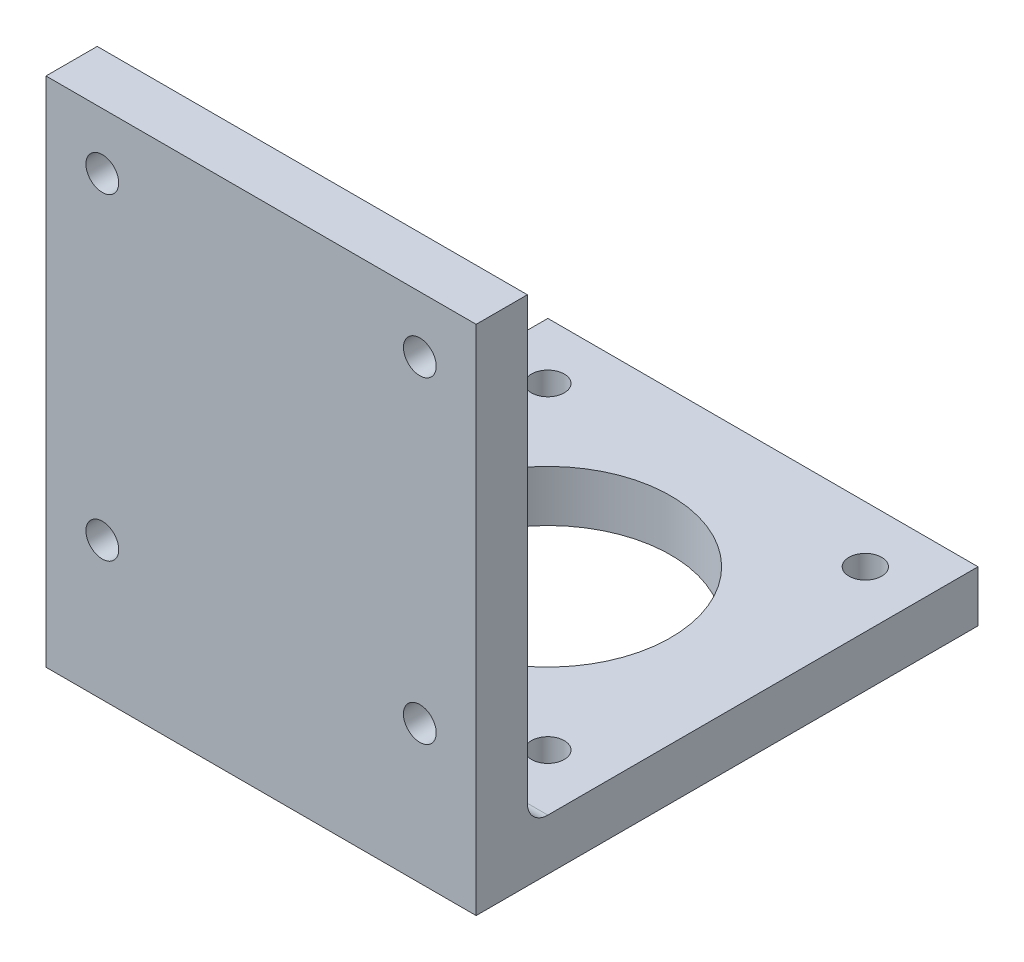
ISO-10303-21;
HEADER;
FILE_DESCRIPTION(('STEP AP214'),'2;1');
FILE_NAME('part.step','',(''),(''),'','','');
FILE_SCHEMA(('AUTOMOTIVE_DESIGN { 1 0 10303 214 1 1 1 1 }'));
ENDSEC;
DATA;
#1=APPLICATION_CONTEXT('core data for automotive mechanical design processes');
#2=APPLICATION_PROTOCOL_DEFINITION('international standard','automotive_design',2000,#1);
#3=PRODUCT_CONTEXT('',#1,'mechanical');
#4=PRODUCT('Part','Part','',(#3));
#5=PRODUCT_RELATED_PRODUCT_CATEGORY('part','',(#4));
#6=PRODUCT_DEFINITION_FORMATION('','',#4);
#7=PRODUCT_DEFINITION_CONTEXT('part definition',#1,'design');
#8=PRODUCT_DEFINITION('design','',#6,#7);
#9=PRODUCT_DEFINITION_SHAPE('','',#8);
#10=(LENGTH_UNIT() NAMED_UNIT(*) SI_UNIT(.MILLI.,.METRE.));
#11=(NAMED_UNIT(*) PLANE_ANGLE_UNIT() SI_UNIT($,.RADIAN.));
#12=(NAMED_UNIT(*) SI_UNIT($,.STERADIAN.) SOLID_ANGLE_UNIT());
#13=UNCERTAINTY_MEASURE_WITH_UNIT(LENGTH_MEASURE(1.E-05),#10,'distance_accuracy_value','');
#14=(GEOMETRIC_REPRESENTATION_CONTEXT(3) GLOBAL_UNCERTAINTY_ASSIGNED_CONTEXT((#13)) GLOBAL_UNIT_ASSIGNED_CONTEXT((#10,
#11,#12)) REPRESENTATION_CONTEXT('',''));
#15=CARTESIAN_POINT('',(0.,0.,0.));
#16=DIRECTION('',(0.,0.,1.));
#17=DIRECTION('',(1.,0.,0.));
#18=AXIS2_PLACEMENT_3D('',#15,#16,#17);
#19=CARTESIAN_POINT('',(0.,5.,0.));
#20=DIRECTION('',(0.,-1.,0.));
#21=DIRECTION('',(0.,0.,-1.));
#22=AXIS2_PLACEMENT_3D('',#19,#20,#21);
#23=PLANE('',#22);
#24=DIRECTION('',(0.,0.,1.));
#25=VECTOR('',#24,1.);
#26=CARTESIAN_POINT('',(-21.,5.,21.));
#27=LINE('',#26,#25);
#28=CARTESIAN_POINT('',(-21.,5.,-21.));
#29=VERTEX_POINT('',#28);
#30=CARTESIAN_POINT('',(-21.,5.,21.));
#31=VERTEX_POINT('',#30);
#32=EDGE_CURVE('E171',#29,#31,#27,.T.);
#33=ORIENTED_EDGE('',*,*,#32,.T.);
#34=DIRECTION('',(1.,0.,0.));
#35=VECTOR('',#34,1.);
#36=CARTESIAN_POINT('',(0.,5.,21.));
#37=LINE('',#36,#35);
#38=CARTESIAN_POINT('',(21.,5.,21.));
#39=VERTEX_POINT('',#38);
#40=EDGE_CURVE('E180',#31,#39,#37,.T.);
#41=ORIENTED_EDGE('',*,*,#40,.T.);
#42=DIRECTION('',(0.,0.,-1.));
#43=VECTOR('',#42,1.);
#44=CARTESIAN_POINT('',(21.,5.,21.));
#45=LINE('',#44,#43);
#46=CARTESIAN_POINT('',(21.,5.,-21.));
#47=VERTEX_POINT('',#46);
#48=EDGE_CURVE('E167',#39,#47,#45,.T.);
#49=ORIENTED_EDGE('',*,*,#48,.T.);
#50=DIRECTION('',(-1.,0.,0.));
#51=VECTOR('',#50,1.);
#52=CARTESIAN_POINT('',(-21.,5.,-21.));
#53=LINE('',#52,#51);
#54=EDGE_CURVE('E169',#47,#29,#53,.T.);
#55=ORIENTED_EDGE('',*,*,#54,.T.);
#56=EDGE_LOOP('',(#33,#41,#49,#55));
#57=FACE_BOUND('',#56,.T.);
#58=CARTESIAN_POINT('',(-15.5,5.,-15.5));
#59=DIRECTION('',(0.,1.,0.));
#60=DIRECTION('',(0.,0.,1.));
#61=AXIS2_PLACEMENT_3D('',#58,#59,#60);
#62=CIRCLE('',#61,1.6);
#63=CARTESIAN_POINT('',(-15.5,5.,-13.9));
#64=VERTEX_POINT('',#63);
#65=EDGE_CURVE('E162',#64,#64,#62,.T.);
#66=ORIENTED_EDGE('',*,*,#65,.F.);
#67=EDGE_LOOP('',(#66));
#68=FACE_BOUND('',#67,.T.);
#69=CARTESIAN_POINT('',(0.,5.,0.));
#70=DIRECTION('',(0.,1.,0.));
#71=DIRECTION('',(0.,0.,1.));
#72=AXIS2_PLACEMENT_3D('',#69,#70,#71);
#73=CIRCLE('',#72,12.);
#74=CARTESIAN_POINT('',(0.,5.,12.));
#75=VERTEX_POINT('',#74);
#76=EDGE_CURVE('E156',#75,#75,#73,.T.);
#77=ORIENTED_EDGE('',*,*,#76,.F.);
#78=EDGE_LOOP('',(#77));
#79=FACE_BOUND('',#78,.T.);
#80=CARTESIAN_POINT('',(15.5,5.,-15.5));
#81=DIRECTION('',(0.,1.,0.));
#82=DIRECTION('',(0.,0.,1.));
#83=AXIS2_PLACEMENT_3D('',#80,#81,#82);
#84=CIRCLE('',#83,1.6);
#85=CARTESIAN_POINT('',(15.5,5.,-13.9));
#86=VERTEX_POINT('',#85);
#87=EDGE_CURVE('E150',#86,#86,#84,.T.);
#88=ORIENTED_EDGE('',*,*,#87,.F.);
#89=EDGE_LOOP('',(#88));
#90=FACE_BOUND('',#89,.T.);
#91=CARTESIAN_POINT('',(-15.5,5.,15.5));
#92=DIRECTION('',(0.,1.,0.));
#93=DIRECTION('',(0.,0.,1.));
#94=AXIS2_PLACEMENT_3D('',#91,#92,#93);
#95=CIRCLE('',#94,1.6);
#96=CARTESIAN_POINT('',(-15.5,5.,17.1));
#97=VERTEX_POINT('',#96);
#98=EDGE_CURVE('E144',#97,#97,#95,.T.);
#99=ORIENTED_EDGE('',*,*,#98,.F.);
#100=EDGE_LOOP('',(#99));
#101=FACE_BOUND('',#100,.T.);
#102=CARTESIAN_POINT('',(15.5,5.,15.5));
#103=DIRECTION('',(0.,1.,0.));
#104=DIRECTION('',(0.,0.,1.));
#105=AXIS2_PLACEMENT_3D('',#102,#103,#104);
#106=CIRCLE('',#105,1.6);
#107=CARTESIAN_POINT('',(15.5,5.,17.1));
#108=VERTEX_POINT('',#107);
#109=EDGE_CURVE('E138',#108,#108,#106,.T.);
#110=ORIENTED_EDGE('',*,*,#109,.F.);
#111=EDGE_LOOP('',(#110));
#112=FACE_BOUND('',#111,.T.);
#113=ADVANCED_FACE('F32',(#57,#68,#79,#90,#101,#112),#23,.F.);
#114=CARTESIAN_POINT('',(0.,0.,0.));
#115=DIRECTION('',(0.,-1.,0.));
#116=DIRECTION('',(0.,0.,-1.));
#117=AXIS2_PLACEMENT_3D('',#114,#115,#116);
#118=PLANE('',#117);
#119=CARTESIAN_POINT('',(-15.5,0.,15.5));
#120=DIRECTION('',(0.,1.,0.));
#121=DIRECTION('',(0.,0.,1.));
#122=AXIS2_PLACEMENT_3D('',#119,#120,#121);
#123=CIRCLE('',#122,1.6);
#124=CARTESIAN_POINT('',(-15.5,0.,17.1));
#125=VERTEX_POINT('',#124);
#126=EDGE_CURVE('E141',#125,#125,#123,.T.);
#127=ORIENTED_EDGE('',*,*,#126,.T.);
#128=EDGE_LOOP('',(#127));
#129=FACE_BOUND('',#128,.T.);
#130=CARTESIAN_POINT('',(0.,0.,0.));
#131=DIRECTION('',(0.,1.,0.));
#132=DIRECTION('',(0.,0.,1.));
#133=AXIS2_PLACEMENT_3D('',#130,#131,#132);
#134=CIRCLE('',#133,12.);
#135=CARTESIAN_POINT('',(0.,0.,12.));
#136=VERTEX_POINT('',#135);
#137=EDGE_CURVE('E153',#136,#136,#134,.T.);
#138=ORIENTED_EDGE('',*,*,#137,.T.);
#139=EDGE_LOOP('',(#138));
#140=FACE_BOUND('',#139,.T.);
#141=DIRECTION('',(-1.,0.,0.));
#142=VECTOR('',#141,1.);
#143=CARTESIAN_POINT('',(-21.,0.,-21.));
#144=LINE('',#143,#142);
#145=CARTESIAN_POINT('',(21.,0.,-21.));
#146=VERTEX_POINT('',#145);
#147=CARTESIAN_POINT('',(-21.,0.,-21.));
#148=VERTEX_POINT('',#147);
#149=EDGE_CURVE('E103',#146,#148,#144,.T.);
#150=ORIENTED_EDGE('',*,*,#149,.F.);
#151=DIRECTION('',(0.,0.,-1.));
#152=VECTOR('',#151,1.);
#153=CARTESIAN_POINT('',(21.,0.,21.));
#154=LINE('',#153,#152);
#155=CARTESIAN_POINT('',(21.,0.,28.));
#156=VERTEX_POINT('',#155);
#157=EDGE_CURVE('E102',#156,#146,#154,.T.);
#158=ORIENTED_EDGE('',*,*,#157,.F.);
#159=DIRECTION('',(1.,0.,0.));
#160=VECTOR('',#159,1.);
#161=CARTESIAN_POINT('',(-21.,0.,28.));
#162=LINE('',#161,#160);
#163=CARTESIAN_POINT('',(-21.,0.,28.));
#164=VERTEX_POINT('',#163);
#165=EDGE_CURVE('E106',#164,#156,#162,.T.);
#166=ORIENTED_EDGE('',*,*,#165,.F.);
#167=DIRECTION('',(0.,0.,1.));
#168=VECTOR('',#167,1.);
#169=CARTESIAN_POINT('',(-21.,0.,21.));
#170=LINE('',#169,#168);
#171=EDGE_CURVE('E90',#148,#164,#170,.T.);
#172=ORIENTED_EDGE('',*,*,#171,.F.);
#173=EDGE_LOOP('',(#150,#158,#166,#172));
#174=FACE_BOUND('',#173,.T.);
#175=CARTESIAN_POINT('',(-15.5,0.,-15.5));
#176=DIRECTION('',(0.,1.,0.));
#177=DIRECTION('',(0.,0.,1.));
#178=AXIS2_PLACEMENT_3D('',#175,#176,#177);
#179=CIRCLE('',#178,1.6);
#180=CARTESIAN_POINT('',(-15.5,0.,-13.9));
#181=VERTEX_POINT('',#180);
#182=EDGE_CURVE('E159',#181,#181,#179,.T.);
#183=ORIENTED_EDGE('',*,*,#182,.T.);
#184=EDGE_LOOP('',(#183));
#185=FACE_BOUND('',#184,.T.);
#186=CARTESIAN_POINT('',(15.5,0.,-15.5));
#187=DIRECTION('',(0.,1.,0.));
#188=DIRECTION('',(0.,0.,1.));
#189=AXIS2_PLACEMENT_3D('',#186,#187,#188);
#190=CIRCLE('',#189,1.6);
#191=CARTESIAN_POINT('',(15.5,0.,-13.9));
#192=VERTEX_POINT('',#191);
#193=EDGE_CURVE('E147',#192,#192,#190,.T.);
#194=ORIENTED_EDGE('',*,*,#193,.T.);
#195=EDGE_LOOP('',(#194));
#196=FACE_BOUND('',#195,.T.);
#197=CARTESIAN_POINT('',(15.5,0.,15.5));
#198=DIRECTION('',(0.,1.,0.));
#199=DIRECTION('',(0.,0.,1.));
#200=AXIS2_PLACEMENT_3D('',#197,#198,#199);
#201=CIRCLE('',#200,1.6);
#202=CARTESIAN_POINT('',(15.5,0.,17.1));
#203=VERTEX_POINT('',#202);
#204=EDGE_CURVE('E137',#203,#203,#201,.T.);
#205=ORIENTED_EDGE('',*,*,#204,.T.);
#206=EDGE_LOOP('',(#205));
#207=FACE_BOUND('',#206,.T.);
#208=ADVANCED_FACE('F107',(#129,#140,#174,#185,#196,#207),#118,.T.);
#209=CARTESIAN_POINT('',(-21.,5.,-21.));
#210=DIRECTION('',(0.,0.,1.));
#211=DIRECTION('',(1.,0.,0.));
#212=AXIS2_PLACEMENT_3D('',#209,#210,#211);
#213=PLANE('',#212);
#214=ORIENTED_EDGE('',*,*,#149,.T.);
#215=DIRECTION('',(0.,-1.,0.));
#216=VECTOR('',#215,1.);
#217=CARTESIAN_POINT('',(-21.,5.,-21.));
#218=LINE('',#217,#216);
#219=EDGE_CURVE('E98',#29,#148,#218,.T.);
#220=ORIENTED_EDGE('',*,*,#219,.F.);
#221=ORIENTED_EDGE('',*,*,#54,.F.);
#222=DIRECTION('',(0.,-1.,0.));
#223=VECTOR('',#222,1.);
#224=CARTESIAN_POINT('',(21.,5.,-21.));
#225=LINE('',#224,#223);
#226=EDGE_CURVE('E177',#47,#146,#225,.T.);
#227=ORIENTED_EDGE('',*,*,#226,.T.);
#228=EDGE_LOOP('',(#214,#220,#221,#227));
#229=FACE_BOUND('',#228,.T.);
#230=ADVANCED_FACE('F192',(#229),#213,.F.);
#231=CARTESIAN_POINT('',(-21.,5.,21.));
#232=DIRECTION('',(1.,0.,0.));
#233=DIRECTION('',(0.,0.,-1.));
#234=AXIS2_PLACEMENT_3D('',#231,#232,#233);
#235=PLANE('',#234);
#236=ORIENTED_EDGE('',*,*,#171,.T.);
#237=DIRECTION('',(0.,-1.,0.));
#238=VECTOR('',#237,1.);
#239=CARTESIAN_POINT('',(-21.,0.,28.));
#240=LINE('',#239,#238);
#241=CARTESIAN_POINT('',(-21.,50.,28.));
#242=VERTEX_POINT('',#241);
#243=EDGE_CURVE('E95',#242,#164,#240,.T.);
#244=ORIENTED_EDGE('',*,*,#243,.F.);
#245=DIRECTION('',(0.,0.,-1.));
#246=VECTOR('',#245,1.);
#247=CARTESIAN_POINT('',(-21.,50.,28.));
#248=LINE('',#247,#246);
#249=CARTESIAN_POINT('',(-21.,50.,23.));
#250=VERTEX_POINT('',#249);
#251=EDGE_CURVE('E128',#242,#250,#248,.T.);
#252=ORIENTED_EDGE('',*,*,#251,.T.);
#253=DIRECTION('',(0.,-1.,0.));
#254=VECTOR('',#253,1.);
#255=CARTESIAN_POINT('',(-21.,0.,23.));
#256=LINE('',#255,#254);
#257=CARTESIAN_POINT('',(-21.,7.,23.));
#258=VERTEX_POINT('',#257);
#259=EDGE_CURVE('E129',#250,#258,#256,.T.);
#260=ORIENTED_EDGE('',*,*,#259,.T.);
#261=CARTESIAN_POINT('',(-21.,7.,21.));
#262=DIRECTION('',(1.,0.,0.));
#263=DIRECTION('',(0.,0.,-1.));
#264=AXIS2_PLACEMENT_3D('',#261,#262,#263);
#265=CIRCLE('',#264,2.);
#266=EDGE_CURVE('E11',#258,#31,#265,.T.);
#267=ORIENTED_EDGE('',*,*,#266,.T.);
#268=ORIENTED_EDGE('',*,*,#32,.F.);
#269=ORIENTED_EDGE('',*,*,#219,.T.);
#270=EDGE_LOOP('',(#236,#244,#252,#260,#267,#268,#269));
#271=FACE_BOUND('',#270,.T.);
#272=ADVANCED_FACE('F92',(#271),#235,.F.);
#273=CARTESIAN_POINT('',(21.,5.,21.));
#274=DIRECTION('',(-1.,0.,0.));
#275=DIRECTION('',(0.,0.,1.));
#276=AXIS2_PLACEMENT_3D('',#273,#274,#275);
#277=PLANE('',#276);
#278=ORIENTED_EDGE('',*,*,#157,.T.);
#279=ORIENTED_EDGE('',*,*,#226,.F.);
#280=ORIENTED_EDGE('',*,*,#48,.F.);
#281=CARTESIAN_POINT('',(21.,7.,21.));
#282=DIRECTION('',(-1.,0.,0.));
#283=DIRECTION('',(0.,0.,1.));
#284=AXIS2_PLACEMENT_3D('',#281,#282,#283);
#285=CIRCLE('',#284,2.);
#286=CARTESIAN_POINT('',(21.,7.,23.));
#287=VERTEX_POINT('',#286);
#288=EDGE_CURVE('E40',#39,#287,#285,.T.);
#289=ORIENTED_EDGE('',*,*,#288,.T.);
#290=DIRECTION('',(0.,1.,0.));
#291=VECTOR('',#290,1.);
#292=CARTESIAN_POINT('',(21.,0.,23.));
#293=LINE('',#292,#291);
#294=CARTESIAN_POINT('',(21.,50.,23.));
#295=VERTEX_POINT('',#294);
#296=EDGE_CURVE('E120',#287,#295,#293,.T.);
#297=ORIENTED_EDGE('',*,*,#296,.T.);
#298=DIRECTION('',(0.,0.,-1.));
#299=VECTOR('',#298,1.);
#300=CARTESIAN_POINT('',(21.,50.,28.));
#301=LINE('',#300,#299);
#302=CARTESIAN_POINT('',(21.,50.,28.));
#303=VERTEX_POINT('',#302);
#304=EDGE_CURVE('E134',#303,#295,#301,.T.);
#305=ORIENTED_EDGE('',*,*,#304,.F.);
#306=DIRECTION('',(0.,1.,0.));
#307=VECTOR('',#306,1.);
#308=CARTESIAN_POINT('',(21.,0.,28.));
#309=LINE('',#308,#307);
#310=EDGE_CURVE('E111',#156,#303,#309,.T.);
#311=ORIENTED_EDGE('',*,*,#310,.F.);
#312=EDGE_LOOP('',(#278,#279,#280,#289,#297,#305,#311));
#313=FACE_BOUND('',#312,.T.);
#314=ADVANCED_FACE('F190',(#313),#277,.F.);
#315=CARTESIAN_POINT('',(-15.5,5.,-15.5));
#316=DIRECTION('',(0.,-1.,0.));
#317=DIRECTION('',(0.,0.,-1.));
#318=AXIS2_PLACEMENT_3D('',#315,#316,#317);
#319=CYLINDRICAL_SURFACE('',#318,1.6);
#320=ORIENTED_EDGE('',*,*,#65,.T.);
#321=EDGE_LOOP('',(#320));
#322=FACE_BOUND('',#321,.T.);
#323=ORIENTED_EDGE('',*,*,#182,.F.);
#324=EDGE_LOOP('',(#323));
#325=FACE_BOUND('',#324,.T.);
#326=ADVANCED_FACE('F209',(#322,#325),#319,.F.);
#327=CARTESIAN_POINT('',(0.,5.,0.));
#328=DIRECTION('',(0.,-1.,0.));
#329=DIRECTION('',(0.,0.,-1.));
#330=AXIS2_PLACEMENT_3D('',#327,#328,#329);
#331=CYLINDRICAL_SURFACE('',#330,12.);
#332=ORIENTED_EDGE('',*,*,#76,.T.);
#333=EDGE_LOOP('',(#332));
#334=FACE_BOUND('',#333,.T.);
#335=ORIENTED_EDGE('',*,*,#137,.F.);
#336=EDGE_LOOP('',(#335));
#337=FACE_BOUND('',#336,.T.);
#338=ADVANCED_FACE('F235',(#334,#337),#331,.F.);
#339=CARTESIAN_POINT('',(15.5,5.,-15.5));
#340=DIRECTION('',(0.,-1.,0.));
#341=DIRECTION('',(0.,0.,-1.));
#342=AXIS2_PLACEMENT_3D('',#339,#340,#341);
#343=CYLINDRICAL_SURFACE('',#342,1.6);
#344=ORIENTED_EDGE('',*,*,#87,.T.);
#345=EDGE_LOOP('',(#344));
#346=FACE_BOUND('',#345,.T.);
#347=ORIENTED_EDGE('',*,*,#193,.F.);
#348=EDGE_LOOP('',(#347));
#349=FACE_BOUND('',#348,.T.);
#350=ADVANCED_FACE('F242',(#346,#349),#343,.F.);
#351=CARTESIAN_POINT('',(-15.5,5.,15.5));
#352=DIRECTION('',(0.,-1.,0.));
#353=DIRECTION('',(0.,0.,-1.));
#354=AXIS2_PLACEMENT_3D('',#351,#352,#353);
#355=CYLINDRICAL_SURFACE('',#354,1.6);
#356=ORIENTED_EDGE('',*,*,#98,.T.);
#357=EDGE_LOOP('',(#356));
#358=FACE_BOUND('',#357,.T.);
#359=ORIENTED_EDGE('',*,*,#126,.F.);
#360=EDGE_LOOP('',(#359));
#361=FACE_BOUND('',#360,.T.);
#362=ADVANCED_FACE('F249',(#358,#361),#355,.F.);
#363=CARTESIAN_POINT('',(15.5,5.,15.5));
#364=DIRECTION('',(0.,-1.,0.));
#365=DIRECTION('',(0.,0.,-1.));
#366=AXIS2_PLACEMENT_3D('',#363,#364,#365);
#367=CYLINDRICAL_SURFACE('',#366,1.6);
#368=ORIENTED_EDGE('',*,*,#109,.T.);
#369=EDGE_LOOP('',(#368));
#370=FACE_BOUND('',#369,.T.);
#371=ORIENTED_EDGE('',*,*,#204,.F.);
#372=EDGE_LOOP('',(#371));
#373=FACE_BOUND('',#372,.T.);
#374=ADVANCED_FACE('F257',(#370,#373),#367,.F.);
#375=CARTESIAN_POINT('',(0.,0.,23.));
#376=DIRECTION('',(0.,0.,-1.));
#377=DIRECTION('',(-1.,0.,0.));
#378=AXIS2_PLACEMENT_3D('',#375,#376,#377);
#379=PLANE('',#378);
#380=CARTESIAN_POINT('',(15.5,44.5,23.));
#381=DIRECTION('',(0.,0.,1.));
#382=DIRECTION('',(1.,0.,0.));
#383=AXIS2_PLACEMENT_3D('',#380,#381,#382);
#384=CIRCLE('',#383,1.6);
#385=CARTESIAN_POINT('',(17.1,44.5,23.));
#386=VERTEX_POINT('',#385);
#387=EDGE_CURVE('E386',#386,#386,#384,.T.);
#388=ORIENTED_EDGE('',*,*,#387,.T.);
#389=EDGE_LOOP('',(#388));
#390=FACE_BOUND('',#389,.T.);
#391=CARTESIAN_POINT('',(15.5,13.5,23.));
#392=DIRECTION('',(0.,0.,1.));
#393=DIRECTION('',(1.,0.,0.));
#394=AXIS2_PLACEMENT_3D('',#391,#392,#393);
#395=CIRCLE('',#394,1.6);
#396=CARTESIAN_POINT('',(17.1,13.5,23.));
#397=VERTEX_POINT('',#396);
#398=EDGE_CURVE('E383',#397,#397,#395,.T.);
#399=ORIENTED_EDGE('',*,*,#398,.T.);
#400=EDGE_LOOP('',(#399));
#401=FACE_BOUND('',#400,.T.);
#402=CARTESIAN_POINT('',(-15.5,44.5,23.));
#403=DIRECTION('',(0.,0.,1.));
#404=DIRECTION('',(1.,0.,0.));
#405=AXIS2_PLACEMENT_3D('',#402,#403,#404);
#406=CIRCLE('',#405,1.6);
#407=CARTESIAN_POINT('',(-13.9,44.5,23.));
#408=VERTEX_POINT('',#407);
#409=EDGE_CURVE('E123',#408,#408,#406,.T.);
#410=ORIENTED_EDGE('',*,*,#409,.T.);
#411=EDGE_LOOP('',(#410));
#412=FACE_BOUND('',#411,.T.);
#413=CARTESIAN_POINT('',(-15.5,13.5,23.));
#414=DIRECTION('',(0.,0.,1.));
#415=DIRECTION('',(1.,0.,0.));
#416=AXIS2_PLACEMENT_3D('',#413,#414,#415);
#417=CIRCLE('',#416,1.6);
#418=CARTESIAN_POINT('',(-13.9,13.5,23.));
#419=VERTEX_POINT('',#418);
#420=EDGE_CURVE('E379',#419,#419,#417,.T.);
#421=ORIENTED_EDGE('',*,*,#420,.T.);
#422=EDGE_LOOP('',(#421));
#423=FACE_BOUND('',#422,.T.);
#424=ORIENTED_EDGE('',*,*,#296,.F.);
#425=DIRECTION('',(1.,0.,0.));
#426=VECTOR('',#425,1.);
#427=CARTESIAN_POINT('',(0.,7.,23.));
#428=LINE('',#427,#426);
#429=EDGE_CURVE('E53',#287,#258,#428,.F.);
#430=ORIENTED_EDGE('',*,*,#429,.T.);
#431=ORIENTED_EDGE('',*,*,#259,.F.);
#432=DIRECTION('',(-1.,0.,0.));
#433=VECTOR('',#432,1.);
#434=CARTESIAN_POINT('',(-21.,50.,23.));
#435=LINE('',#434,#433);
#436=EDGE_CURVE('E118',#295,#250,#435,.T.);
#437=ORIENTED_EDGE('',*,*,#436,.F.);
#438=EDGE_LOOP('',(#424,#430,#431,#437));
#439=FACE_BOUND('',#438,.T.);
#440=ADVANCED_FACE('F265',(#390,#401,#412,#423,#439),#379,.T.);
#441=CARTESIAN_POINT('',(0.,0.,28.));
#442=DIRECTION('',(0.,0.,-1.));
#443=DIRECTION('',(-1.,0.,0.));
#444=AXIS2_PLACEMENT_3D('',#441,#442,#443);
#445=PLANE('',#444);
#446=ORIENTED_EDGE('',*,*,#243,.T.);
#447=ORIENTED_EDGE('',*,*,#165,.T.);
#448=ORIENTED_EDGE('',*,*,#310,.T.);
#449=DIRECTION('',(-1.,0.,0.));
#450=VECTOR('',#449,1.);
#451=CARTESIAN_POINT('',(-21.,50.,28.));
#452=LINE('',#451,#450);
#453=EDGE_CURVE('E116',#303,#242,#452,.T.);
#454=ORIENTED_EDGE('',*,*,#453,.T.);
#455=EDGE_LOOP('',(#446,#447,#448,#454));
#456=FACE_BOUND('',#455,.T.);
#457=CARTESIAN_POINT('',(-15.5,44.5,28.));
#458=DIRECTION('',(0.,0.,1.));
#459=DIRECTION('',(1.,0.,0.));
#460=AXIS2_PLACEMENT_3D('',#457,#458,#459);
#461=CIRCLE('',#460,1.6);
#462=CARTESIAN_POINT('',(-13.9,44.5,28.));
#463=VERTEX_POINT('',#462);
#464=EDGE_CURVE('E131',#463,#463,#461,.T.);
#465=ORIENTED_EDGE('',*,*,#464,.F.);
#466=EDGE_LOOP('',(#465));
#467=FACE_BOUND('',#466,.T.);
#468=CARTESIAN_POINT('',(15.5,13.5,28.));
#469=DIRECTION('',(0.,0.,1.));
#470=DIRECTION('',(1.,0.,0.));
#471=AXIS2_PLACEMENT_3D('',#468,#469,#470);
#472=CIRCLE('',#471,1.6);
#473=CARTESIAN_POINT('',(17.1,13.5,28.));
#474=VERTEX_POINT('',#473);
#475=EDGE_CURVE('E390',#474,#474,#472,.T.);
#476=ORIENTED_EDGE('',*,*,#475,.F.);
#477=EDGE_LOOP('',(#476));
#478=FACE_BOUND('',#477,.T.);
#479=CARTESIAN_POINT('',(-15.5,13.5,28.));
#480=DIRECTION('',(0.,0.,1.));
#481=DIRECTION('',(1.,0.,0.));
#482=AXIS2_PLACEMENT_3D('',#479,#480,#481);
#483=CIRCLE('',#482,1.6);
#484=CARTESIAN_POINT('',(-13.9,13.5,28.));
#485=VERTEX_POINT('',#484);
#486=EDGE_CURVE('E376',#485,#485,#483,.T.);
#487=ORIENTED_EDGE('',*,*,#486,.F.);
#488=EDGE_LOOP('',(#487));
#489=FACE_BOUND('',#488,.T.);
#490=CARTESIAN_POINT('',(15.5,44.5,28.));
#491=DIRECTION('',(0.,0.,1.));
#492=DIRECTION('',(1.,0.,0.));
#493=AXIS2_PLACEMENT_3D('',#490,#491,#492);
#494=CIRCLE('',#493,1.6);
#495=CARTESIAN_POINT('',(17.1,44.5,28.));
#496=VERTEX_POINT('',#495);
#497=EDGE_CURVE('E381',#496,#496,#494,.T.);
#498=ORIENTED_EDGE('',*,*,#497,.F.);
#499=EDGE_LOOP('',(#498));
#500=FACE_BOUND('',#499,.T.);
#501=ADVANCED_FACE('F113',(#456,#467,#478,#489,#500),#445,.F.);
#502=CARTESIAN_POINT('',(-21.,50.,28.));
#503=DIRECTION('',(0.,-1.,0.));
#504=DIRECTION('',(0.,0.,-1.));
#505=AXIS2_PLACEMENT_3D('',#502,#503,#504);
#506=PLANE('',#505);
#507=ORIENTED_EDGE('',*,*,#436,.T.);
#508=ORIENTED_EDGE('',*,*,#251,.F.);
#509=ORIENTED_EDGE('',*,*,#453,.F.);
#510=ORIENTED_EDGE('',*,*,#304,.T.);
#511=EDGE_LOOP('',(#507,#508,#509,#510));
#512=FACE_BOUND('',#511,.T.);
#513=ADVANCED_FACE('F279',(#512),#506,.F.);
#514=CARTESIAN_POINT('',(-15.5,44.5,28.));
#515=DIRECTION('',(0.,0.,-1.));
#516=DIRECTION('',(-1.,0.,0.));
#517=AXIS2_PLACEMENT_3D('',#514,#515,#516);
#518=CYLINDRICAL_SURFACE('',#517,1.6);
#519=ORIENTED_EDGE('',*,*,#464,.T.);
#520=EDGE_LOOP('',(#519));
#521=FACE_BOUND('',#520,.T.);
#522=ORIENTED_EDGE('',*,*,#409,.F.);
#523=EDGE_LOOP('',(#522));
#524=FACE_BOUND('',#523,.T.);
#525=ADVANCED_FACE('F286',(#521,#524),#518,.F.);
#526=CARTESIAN_POINT('',(15.5,13.5,28.));
#527=DIRECTION('',(0.,0.,-1.));
#528=DIRECTION('',(-1.,0.,0.));
#529=AXIS2_PLACEMENT_3D('',#526,#527,#528);
#530=CYLINDRICAL_SURFACE('',#529,1.6);
#531=ORIENTED_EDGE('',*,*,#475,.T.);
#532=EDGE_LOOP('',(#531));
#533=FACE_BOUND('',#532,.T.);
#534=ORIENTED_EDGE('',*,*,#398,.F.);
#535=EDGE_LOOP('',(#534));
#536=FACE_BOUND('',#535,.T.);
#537=ADVANCED_FACE('F294',(#533,#536),#530,.F.);
#538=CARTESIAN_POINT('',(-15.5,13.5,28.));
#539=DIRECTION('',(0.,0.,-1.));
#540=DIRECTION('',(-1.,0.,0.));
#541=AXIS2_PLACEMENT_3D('',#538,#539,#540);
#542=CYLINDRICAL_SURFACE('',#541,1.6);
#543=ORIENTED_EDGE('',*,*,#486,.T.);
#544=EDGE_LOOP('',(#543));
#545=FACE_BOUND('',#544,.T.);
#546=ORIENTED_EDGE('',*,*,#420,.F.);
#547=EDGE_LOOP('',(#546));
#548=FACE_BOUND('',#547,.T.);
#549=ADVANCED_FACE('F198',(#545,#548),#542,.F.);
#550=CARTESIAN_POINT('',(15.5,44.5,28.));
#551=DIRECTION('',(0.,0.,-1.));
#552=DIRECTION('',(-1.,0.,0.));
#553=AXIS2_PLACEMENT_3D('',#550,#551,#552);
#554=CYLINDRICAL_SURFACE('',#553,1.6);
#555=ORIENTED_EDGE('',*,*,#497,.T.);
#556=EDGE_LOOP('',(#555));
#557=FACE_BOUND('',#556,.T.);
#558=ORIENTED_EDGE('',*,*,#387,.F.);
#559=EDGE_LOOP('',(#558));
#560=FACE_BOUND('',#559,.T.);
#561=ADVANCED_FACE('F194',(#557,#560),#554,.F.);
#562=CARTESIAN_POINT('',(0.,7.,21.));
#563=DIRECTION('',(1.,0.,0.));
#564=DIRECTION('',(0.,0.,-1.));
#565=AXIS2_PLACEMENT_3D('',#562,#563,#564);
#566=CYLINDRICAL_SURFACE('',#565,2.);
#567=ORIENTED_EDGE('',*,*,#266,.F.);
#568=ORIENTED_EDGE('',*,*,#429,.F.);
#569=ORIENTED_EDGE('',*,*,#288,.F.);
#570=ORIENTED_EDGE('',*,*,#40,.F.);
#571=EDGE_LOOP('',(#567,#568,#569,#570));
#572=FACE_BOUND('',#571,.T.);
#573=ADVANCED_FACE('F34',(#572),#566,.F.);
#574=CLOSED_SHELL('',(#113,#208,#230,#272,#314,#326,#338,#350,#362,#374,#440,#501,#513,#525,
#537,#549,#561,#573));
#575=MANIFOLD_SOLID_BREP('B2',#574);
#576=ADVANCED_BREP_SHAPE_REPRESENTATION('',(#18,#575),#14);
#577=SHAPE_DEFINITION_REPRESENTATION(#9,#576);
ENDSEC;
END-ISO-10303-21;
